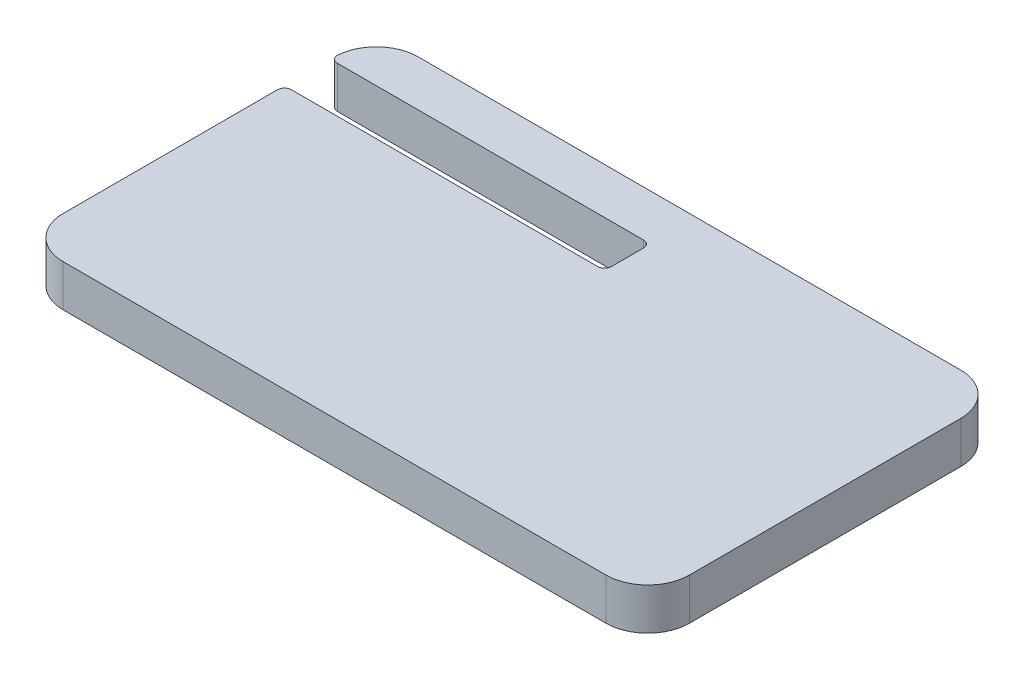
ISO-10303-21;
HEADER;
FILE_DESCRIPTION(('STEP AP214'),'2;1');
FILE_NAME('part.step','',(''),(''),'','','');
FILE_SCHEMA(('AUTOMOTIVE_DESIGN { 1 0 10303 214 1 1 1 1 }'));
ENDSEC;
DATA;
#1=APPLICATION_CONTEXT('core data for automotive mechanical design processes');
#2=APPLICATION_PROTOCOL_DEFINITION('international standard','automotive_design',2000,#1);
#3=PRODUCT_CONTEXT('',#1,'mechanical');
#4=PRODUCT('Part','Part','',(#3));
#5=PRODUCT_RELATED_PRODUCT_CATEGORY('part','',(#4));
#6=PRODUCT_DEFINITION_FORMATION('','',#4);
#7=PRODUCT_DEFINITION_CONTEXT('part definition',#1,'design');
#8=PRODUCT_DEFINITION('design','',#6,#7);
#9=PRODUCT_DEFINITION_SHAPE('','',#8);
#10=(LENGTH_UNIT() NAMED_UNIT(*) SI_UNIT(.MILLI.,.METRE.));
#11=(NAMED_UNIT(*) PLANE_ANGLE_UNIT() SI_UNIT($,.RADIAN.));
#12=(NAMED_UNIT(*) SI_UNIT($,.STERADIAN.) SOLID_ANGLE_UNIT());
#13=UNCERTAINTY_MEASURE_WITH_UNIT(LENGTH_MEASURE(1.E-05),#10,'distance_accuracy_value','');
#14=(GEOMETRIC_REPRESENTATION_CONTEXT(3) GLOBAL_UNCERTAINTY_ASSIGNED_CONTEXT((#13)) GLOBAL_UNIT_ASSIGNED_CONTEXT((#10,
#11,#12)) REPRESENTATION_CONTEXT('',''));
#15=CARTESIAN_POINT('',(0.,0.,0.));
#16=DIRECTION('',(0.,0.,1.));
#17=DIRECTION('',(1.,0.,0.));
#18=AXIS2_PLACEMENT_3D('',#15,#16,#17);
#19=CARTESIAN_POINT('',(-22.5,3.,-9.92984720943611));
#20=DIRECTION('',(1.,0.,0.));
#21=DIRECTION('',(0.,0.,-1.));
#22=AXIS2_PLACEMENT_3D('',#19,#20,#21);
#23=PLANE('',#22);
#24=DIRECTION('',(0.,0.,1.));
#25=VECTOR('',#24,1.);
#26=CARTESIAN_POINT('',(-22.5,3.,-9.92984720943611));
#27=LINE('',#26,#25);
#28=CARTESIAN_POINT('',(-22.5,3.,-2.82984720943611));
#29=VERTEX_POINT('',#28);
#30=CARTESIAN_POINT('',(-22.5,3.,12.5701527905639));
#31=VERTEX_POINT('',#30);
#32=EDGE_CURVE('E181',#29,#31,#27,.T.);
#33=ORIENTED_EDGE('',*,*,#32,.F.);
#34=DIRECTION('',(0.,1.,0.));
#35=VECTOR('',#34,1.);
#36=CARTESIAN_POINT('',(-22.5,3.,-2.82984720943611));
#37=LINE('',#36,#35);
#38=CARTESIAN_POINT('',(-22.5,0.,-2.82984720943611));
#39=VERTEX_POINT('',#38);
#40=EDGE_CURVE('E216',#29,#39,#37,.F.);
#41=ORIENTED_EDGE('',*,*,#40,.T.);
#42=DIRECTION('',(0.,0.,1.));
#43=VECTOR('',#42,1.);
#44=CARTESIAN_POINT('',(-22.5,0.,-9.92984720943611));
#45=LINE('',#44,#43);
#46=CARTESIAN_POINT('',(-22.5,0.,12.5701527905639));
#47=VERTEX_POINT('',#46);
#48=EDGE_CURVE('E170',#39,#47,#45,.T.);
#49=ORIENTED_EDGE('',*,*,#48,.T.);
#50=DIRECTION('',(0.,-1.,0.));
#51=VECTOR('',#50,1.);
#52=CARTESIAN_POINT('',(-22.5,3.,12.5701527905639));
#53=LINE('',#52,#51);
#54=EDGE_CURVE('E150',#47,#31,#53,.F.);
#55=ORIENTED_EDGE('',*,*,#54,.T.);
#56=EDGE_LOOP('',(#33,#41,#49,#55));
#57=FACE_BOUND('',#56,.T.);
#58=ADVANCED_FACE('F37',(#57),#23,.F.);
#59=CARTESIAN_POINT('',(-22.5,3.,15.5701527905639));
#60=DIRECTION('',(0.,0.,-1.));
#61=DIRECTION('',(-1.,0.,0.));
#62=AXIS2_PLACEMENT_3D('',#59,#60,#61);
#63=PLANE('',#62);
#64=DIRECTION('',(1.,0.,0.));
#65=VECTOR('',#64,1.);
#66=CARTESIAN_POINT('',(-22.5,3.,15.5701527905639));
#67=LINE('',#66,#65);
#68=CARTESIAN_POINT('',(-19.5,3.,15.5701527905639));
#69=VERTEX_POINT('',#68);
#70=CARTESIAN_POINT('',(19.5,3.,15.5701527905639));
#71=VERTEX_POINT('',#70);
#72=EDGE_CURVE('E162',#69,#71,#67,.T.);
#73=ORIENTED_EDGE('',*,*,#72,.F.);
#74=DIRECTION('',(0.,-1.,0.));
#75=VECTOR('',#74,1.);
#76=CARTESIAN_POINT('',(-19.5,3.,15.5701527905639));
#77=LINE('',#76,#75);
#78=CARTESIAN_POINT('',(-19.5,0.,15.5701527905639));
#79=VERTEX_POINT('',#78);
#80=EDGE_CURVE('E148',#69,#79,#77,.T.);
#81=ORIENTED_EDGE('',*,*,#80,.T.);
#82=DIRECTION('',(1.,0.,0.));
#83=VECTOR('',#82,1.);
#84=CARTESIAN_POINT('',(-22.5,0.,15.5701527905639));
#85=LINE('',#84,#83);
#86=CARTESIAN_POINT('',(19.5,0.,15.5701527905639));
#87=VERTEX_POINT('',#86);
#88=EDGE_CURVE('E159',#79,#87,#85,.T.);
#89=ORIENTED_EDGE('',*,*,#88,.T.);
#90=DIRECTION('',(0.,-1.,0.));
#91=VECTOR('',#90,1.);
#92=CARTESIAN_POINT('',(19.5,3.,15.5701527905639));
#93=LINE('',#92,#91);
#94=EDGE_CURVE('E164',#87,#71,#93,.F.);
#95=ORIENTED_EDGE('',*,*,#94,.T.);
#96=EDGE_LOOP('',(#73,#81,#89,#95));
#97=FACE_BOUND('',#96,.T.);
#98=ADVANCED_FACE('F158',(#97),#63,.F.);
#99=CARTESIAN_POINT('',(22.5,3.,-9.92984720943611));
#100=DIRECTION('',(-1.,0.,0.));
#101=DIRECTION('',(0.,0.,1.));
#102=AXIS2_PLACEMENT_3D('',#99,#100,#101);
#103=PLANE('',#102);
#104=DIRECTION('',(0.,0.,-1.));
#105=VECTOR('',#104,1.);
#106=CARTESIAN_POINT('',(22.5,3.,-9.92984720943611));
#107=LINE('',#106,#105);
#108=CARTESIAN_POINT('',(22.5,3.,12.5701527905639));
#109=VERTEX_POINT('',#108);
#110=CARTESIAN_POINT('',(22.5,3.,-6.92984720943611));
#111=VERTEX_POINT('',#110);
#112=EDGE_CURVE('E271',#109,#111,#107,.T.);
#113=ORIENTED_EDGE('',*,*,#112,.F.);
#114=DIRECTION('',(0.,-1.,0.));
#115=VECTOR('',#114,1.);
#116=CARTESIAN_POINT('',(22.5,3.,12.5701527905639));
#117=LINE('',#116,#115);
#118=CARTESIAN_POINT('',(22.5,0.,12.5701527905639));
#119=VERTEX_POINT('',#118);
#120=EDGE_CURVE('E204',#109,#119,#117,.T.);
#121=ORIENTED_EDGE('',*,*,#120,.T.);
#122=DIRECTION('',(0.,0.,-1.));
#123=VECTOR('',#122,1.);
#124=CARTESIAN_POINT('',(22.5,0.,-9.92984720943611));
#125=LINE('',#124,#123);
#126=CARTESIAN_POINT('',(22.5,0.,-6.92984720943611));
#127=VERTEX_POINT('',#126);
#128=EDGE_CURVE('E169',#119,#127,#125,.T.);
#129=ORIENTED_EDGE('',*,*,#128,.T.);
#130=DIRECTION('',(0.,-1.,0.));
#131=VECTOR('',#130,1.);
#132=CARTESIAN_POINT('',(22.5,3.,-6.92984720943611));
#133=LINE('',#132,#131);
#134=EDGE_CURVE('E202',#127,#111,#133,.F.);
#135=ORIENTED_EDGE('',*,*,#134,.T.);
#136=EDGE_LOOP('',(#113,#121,#129,#135));
#137=FACE_BOUND('',#136,.T.);
#138=ADVANCED_FACE('F295',(#137),#103,.F.);
#139=CARTESIAN_POINT('',(-22.5,3.,-9.92984720943611));
#140=DIRECTION('',(0.,0.,1.));
#141=DIRECTION('',(1.,0.,0.));
#142=AXIS2_PLACEMENT_3D('',#139,#140,#141);
#143=PLANE('',#142);
#144=DIRECTION('',(-1.,0.,0.));
#145=VECTOR('',#144,1.);
#146=CARTESIAN_POINT('',(-22.5,0.,-9.92984720943611));
#147=LINE('',#146,#145);
#148=CARTESIAN_POINT('',(19.5,0.,-9.92984720943611));
#149=VERTEX_POINT('',#148);
#150=CARTESIAN_POINT('',(-19.5,0.,-9.92984720943611));
#151=VERTEX_POINT('',#150);
#152=EDGE_CURVE('E173',#149,#151,#147,.T.);
#153=ORIENTED_EDGE('',*,*,#152,.T.);
#154=DIRECTION('',(0.,-1.,0.));
#155=VECTOR('',#154,1.);
#156=CARTESIAN_POINT('',(-19.5,3.,-9.92984720943611));
#157=LINE('',#156,#155);
#158=CARTESIAN_POINT('',(-19.5,3.,-9.92984720943611));
#159=VERTEX_POINT('',#158);
#160=EDGE_CURVE('E200',#151,#159,#157,.F.);
#161=ORIENTED_EDGE('',*,*,#160,.T.);
#162=DIRECTION('',(-1.,0.,0.));
#163=VECTOR('',#162,1.);
#164=CARTESIAN_POINT('',(-22.5,3.,-9.92984720943611));
#165=LINE('',#164,#163);
#166=CARTESIAN_POINT('',(19.5,3.,-9.92984720943611));
#167=VERTEX_POINT('',#166);
#168=EDGE_CURVE('E182',#167,#159,#165,.T.);
#169=ORIENTED_EDGE('',*,*,#168,.F.);
#170=DIRECTION('',(0.,-1.,0.));
#171=VECTOR('',#170,1.);
#172=CARTESIAN_POINT('',(19.5,3.,-9.92984720943611));
#173=LINE('',#172,#171);
#174=EDGE_CURVE('E197',#167,#149,#173,.T.);
#175=ORIENTED_EDGE('',*,*,#174,.T.);
#176=EDGE_LOOP('',(#153,#161,#169,#175));
#177=FACE_BOUND('',#176,.T.);
#178=ADVANCED_FACE('F334',(#177),#143,.F.);
#179=CARTESIAN_POINT('',(0.,3.,0.));
#180=DIRECTION('',(0.,1.,0.));
#181=DIRECTION('',(0.,0.,1.));
#182=AXIS2_PLACEMENT_3D('',#179,#180,#181);
#183=PLANE('',#182);
#184=DIRECTION('',(1.,0.,0.));
#185=VECTOR('',#184,1.);
#186=CARTESIAN_POINT('',(-22.5,3.,-3.32984720943611));
#187=LINE('',#186,#185);
#188=CARTESIAN_POINT('',(-22.,3.,-3.32984720943611));
#189=VERTEX_POINT('',#188);
#190=CARTESIAN_POINT('',(0.,3.,-3.32984720943611));
#191=VERTEX_POINT('',#190);
#192=EDGE_CURVE('E253',#189,#191,#187,.T.);
#193=ORIENTED_EDGE('',*,*,#192,.F.);
#194=CARTESIAN_POINT('',(-22.,3.,-2.82984720943611));
#195=DIRECTION('',(0.,1.,0.));
#196=DIRECTION('',(0.,0.,1.));
#197=AXIS2_PLACEMENT_3D('',#194,#195,#196);
#198=CIRCLE('',#197,0.5);
#199=EDGE_CURVE('E214',#189,#29,#198,.T.);
#200=ORIENTED_EDGE('',*,*,#199,.T.);
#201=ORIENTED_EDGE('',*,*,#32,.T.);
#202=CARTESIAN_POINT('',(-19.5,3.,12.5701527905639));
#203=DIRECTION('',(0.,1.,0.));
#204=DIRECTION('',(0.,0.,1.));
#205=AXIS2_PLACEMENT_3D('',#202,#203,#204);
#206=CIRCLE('',#205,3.);
#207=EDGE_CURVE('E195',#31,#69,#206,.T.);
#208=ORIENTED_EDGE('',*,*,#207,.T.);
#209=ORIENTED_EDGE('',*,*,#72,.T.);
#210=CARTESIAN_POINT('',(19.5,3.,12.5701527905639));
#211=DIRECTION('',(0.,1.,0.));
#212=DIRECTION('',(0.,0.,1.));
#213=AXIS2_PLACEMENT_3D('',#210,#211,#212);
#214=CIRCLE('',#213,3.);
#215=EDGE_CURVE('E190',#71,#109,#214,.T.);
#216=ORIENTED_EDGE('',*,*,#215,.T.);
#217=ORIENTED_EDGE('',*,*,#112,.T.);
#218=CARTESIAN_POINT('',(19.5,3.,-6.92984720943611));
#219=DIRECTION('',(0.,1.,0.));
#220=DIRECTION('',(0.,0.,1.));
#221=AXIS2_PLACEMENT_3D('',#218,#219,#220);
#222=CIRCLE('',#221,3.);
#223=EDGE_CURVE('E188',#111,#167,#222,.T.);
#224=ORIENTED_EDGE('',*,*,#223,.T.);
#225=ORIENTED_EDGE('',*,*,#168,.T.);
#226=CARTESIAN_POINT('',(-19.5,3.,-6.92984720943611));
#227=DIRECTION('',(0.,1.,0.));
#228=DIRECTION('',(0.,0.,1.));
#229=AXIS2_PLACEMENT_3D('',#226,#227,#228);
#230=CIRCLE('',#229,3.);
#231=CARTESIAN_POINT('',(-22.4903845906505,3.,-7.16984720943611));
#232=VERTEX_POINT('',#231);
#233=EDGE_CURVE('E192',#159,#232,#230,.T.);
#234=ORIENTED_EDGE('',*,*,#233,.T.);
#235=CARTESIAN_POINT('',(-21.9919871588754,3.,-7.12984720943611));
#236=DIRECTION('',(0.,1.,0.));
#237=DIRECTION('',(0.,0.,1.));
#238=AXIS2_PLACEMENT_3D('',#235,#236,#237);
#239=CIRCLE('',#238,0.5);
#240=CARTESIAN_POINT('',(-21.9919871588754,3.,-6.62984720943611));
#241=VERTEX_POINT('',#240);
#242=EDGE_CURVE('E212',#232,#241,#239,.T.);
#243=ORIENTED_EDGE('',*,*,#242,.T.);
#244=DIRECTION('',(-1.,0.,0.));
#245=VECTOR('',#244,1.);
#246=CARTESIAN_POINT('',(-22.5,3.,-6.62984720943611));
#247=LINE('',#246,#245);
#248=CARTESIAN_POINT('',(0.,3.,-6.62984720943611));
#249=VERTEX_POINT('',#248);
#250=EDGE_CURVE('E245',#249,#241,#247,.T.);
#251=ORIENTED_EDGE('',*,*,#250,.F.);
#252=CARTESIAN_POINT('',(0.,3.,-6.12984720943611));
#253=DIRECTION('',(0.,1.,0.));
#254=DIRECTION('',(0.,0.,1.));
#255=AXIS2_PLACEMENT_3D('',#252,#253,#254);
#256=CIRCLE('',#255,0.5);
#257=CARTESIAN_POINT('',(0.5,3.,-6.12984720943611));
#258=VERTEX_POINT('',#257);
#259=EDGE_CURVE('E45',#249,#258,#256,.F.);
#260=ORIENTED_EDGE('',*,*,#259,.T.);
#261=DIRECTION('',(0.,0.,-1.));
#262=VECTOR('',#261,1.);
#263=CARTESIAN_POINT('',(0.5,3.,-6.62984720943611));
#264=LINE('',#263,#262);
#265=CARTESIAN_POINT('',(0.500000000000001,3.,-3.82984720943611));
#266=VERTEX_POINT('',#265);
#267=EDGE_CURVE('E243',#266,#258,#264,.T.);
#268=ORIENTED_EDGE('',*,*,#267,.F.);
#269=CARTESIAN_POINT('',(0.,3.,-3.82984720943611));
#270=DIRECTION('',(0.,1.,0.));
#271=DIRECTION('',(0.,0.,1.));
#272=AXIS2_PLACEMENT_3D('',#269,#270,#271);
#273=CIRCLE('',#272,0.5);
#274=EDGE_CURVE('E234',#266,#191,#273,.F.);
#275=ORIENTED_EDGE('',*,*,#274,.T.);
#276=EDGE_LOOP('',(#193,#200,#201,#208,#209,#216,#217,#224,#225,#234,#243,#251,#260,#268,#275));
#277=FACE_BOUND('',#276,.T.);
#278=ADVANCED_FACE('F242',(#277),#183,.T.);
#279=CARTESIAN_POINT('',(0.,0.,0.));
#280=DIRECTION('',(0.,1.,0.));
#281=DIRECTION('',(0.,0.,1.));
#282=AXIS2_PLACEMENT_3D('',#279,#280,#281);
#283=PLANE('',#282);
#284=ORIENTED_EDGE('',*,*,#48,.F.);
#285=CARTESIAN_POINT('',(-22.,0.,-2.82984720943611));
#286=DIRECTION('',(0.,1.,0.));
#287=DIRECTION('',(0.,0.,1.));
#288=AXIS2_PLACEMENT_3D('',#285,#286,#287);
#289=CIRCLE('',#288,0.5);
#290=CARTESIAN_POINT('',(-22.,0.,-3.32984720943611));
#291=VERTEX_POINT('',#290);
#292=EDGE_CURVE('E219',#39,#291,#289,.F.);
#293=ORIENTED_EDGE('',*,*,#292,.T.);
#294=DIRECTION('',(-1.,0.,0.));
#295=VECTOR('',#294,1.);
#296=CARTESIAN_POINT('',(-22.5,0.,-3.32984720943611));
#297=LINE('',#296,#295);
#298=CARTESIAN_POINT('',(0.,0.,-3.32984720943611));
#299=VERTEX_POINT('',#298);
#300=EDGE_CURVE('E175',#299,#291,#297,.T.);
#301=ORIENTED_EDGE('',*,*,#300,.F.);
#302=CARTESIAN_POINT('',(0.,0.,-3.82984720943611));
#303=DIRECTION('',(0.,1.,0.));
#304=DIRECTION('',(0.,0.,1.));
#305=AXIS2_PLACEMENT_3D('',#302,#303,#304);
#306=CIRCLE('',#305,0.5);
#307=CARTESIAN_POINT('',(0.500000000000001,0.,-3.82984720943611));
#308=VERTEX_POINT('',#307);
#309=EDGE_CURVE('E236',#299,#308,#306,.T.);
#310=ORIENTED_EDGE('',*,*,#309,.T.);
#311=DIRECTION('',(0.,0.,1.));
#312=VECTOR('',#311,1.);
#313=CARTESIAN_POINT('',(0.5,0.,-6.62984720943611));
#314=LINE('',#313,#312);
#315=CARTESIAN_POINT('',(0.5,0.,-6.12984720943611));
#316=VERTEX_POINT('',#315);
#317=EDGE_CURVE('E260',#316,#308,#314,.T.);
#318=ORIENTED_EDGE('',*,*,#317,.F.);
#319=CARTESIAN_POINT('',(0.,0.,-6.12984720943611));
#320=DIRECTION('',(0.,1.,0.));
#321=DIRECTION('',(0.,0.,1.));
#322=AXIS2_PLACEMENT_3D('',#319,#320,#321);
#323=CIRCLE('',#322,0.5);
#324=CARTESIAN_POINT('',(0.,0.,-6.62984720943611));
#325=VERTEX_POINT('',#324);
#326=EDGE_CURVE('E11',#316,#325,#323,.T.);
#327=ORIENTED_EDGE('',*,*,#326,.T.);
#328=DIRECTION('',(1.,0.,0.));
#329=VECTOR('',#328,1.);
#330=CARTESIAN_POINT('',(-22.5,0.,-6.62984720943611));
#331=LINE('',#330,#329);
#332=CARTESIAN_POINT('',(-21.9919871588754,0.,-6.62984720943611));
#333=VERTEX_POINT('',#332);
#334=EDGE_CURVE('E259',#333,#325,#331,.T.);
#335=ORIENTED_EDGE('',*,*,#334,.F.);
#336=CARTESIAN_POINT('',(-21.9919871588754,0.,-7.12984720943611));
#337=DIRECTION('',(0.,1.,0.));
#338=DIRECTION('',(0.,0.,1.));
#339=AXIS2_PLACEMENT_3D('',#336,#337,#338);
#340=CIRCLE('',#339,0.5);
#341=CARTESIAN_POINT('',(-22.4903845906505,0.,-7.16984720943611));
#342=VERTEX_POINT('',#341);
#343=EDGE_CURVE('E52',#333,#342,#340,.F.);
#344=ORIENTED_EDGE('',*,*,#343,.T.);
#345=CARTESIAN_POINT('',(-19.5,0.,-6.92984720943611));
#346=DIRECTION('',(0.,1.,0.));
#347=DIRECTION('',(0.,0.,1.));
#348=AXIS2_PLACEMENT_3D('',#345,#346,#347);
#349=CIRCLE('',#348,3.);
#350=EDGE_CURVE('E153',#342,#151,#349,.F.);
#351=ORIENTED_EDGE('',*,*,#350,.T.);
#352=ORIENTED_EDGE('',*,*,#152,.F.);
#353=CARTESIAN_POINT('',(19.5,0.,-6.92984720943611));
#354=DIRECTION('',(0.,1.,0.));
#355=DIRECTION('',(0.,0.,1.));
#356=AXIS2_PLACEMENT_3D('',#353,#354,#355);
#357=CIRCLE('',#356,3.);
#358=EDGE_CURVE('E163',#149,#127,#357,.F.);
#359=ORIENTED_EDGE('',*,*,#358,.T.);
#360=ORIENTED_EDGE('',*,*,#128,.F.);
#361=CARTESIAN_POINT('',(19.5,0.,12.5701527905639));
#362=DIRECTION('',(0.,1.,0.));
#363=DIRECTION('',(0.,0.,1.));
#364=AXIS2_PLACEMENT_3D('',#361,#362,#363);
#365=CIRCLE('',#364,3.);
#366=EDGE_CURVE('E168',#119,#87,#365,.F.);
#367=ORIENTED_EDGE('',*,*,#366,.T.);
#368=ORIENTED_EDGE('',*,*,#88,.F.);
#369=CARTESIAN_POINT('',(-19.5,0.,12.5701527905639));
#370=DIRECTION('',(0.,1.,0.));
#371=DIRECTION('',(0.,0.,1.));
#372=AXIS2_PLACEMENT_3D('',#369,#370,#371);
#373=CIRCLE('',#372,3.);
#374=EDGE_CURVE('E144',#79,#47,#373,.F.);
#375=ORIENTED_EDGE('',*,*,#374,.T.);
#376=EDGE_LOOP('',(#284,#293,#301,#310,#318,#327,#335,#344,#351,#352,#359,#360,#367,#368,#375));
#377=FACE_BOUND('',#376,.T.);
#378=ADVANCED_FACE('F166',(#377),#283,.F.);
#379=CARTESIAN_POINT('',(-22.5,-23.2355331335435,-6.62984720943611));
#380=DIRECTION('',(0.,0.,-1.));
#381=DIRECTION('',(-1.,0.,0.));
#382=AXIS2_PLACEMENT_3D('',#379,#380,#381);
#383=PLANE('',#382);
#384=ORIENTED_EDGE('',*,*,#334,.T.);
#385=DIRECTION('',(0.,1.,0.));
#386=VECTOR('',#385,1.);
#387=CARTESIAN_POINT('',(0.,3.,-6.62984720943611));
#388=LINE('',#387,#386);
#389=EDGE_CURVE('E228',#325,#249,#388,.T.);
#390=ORIENTED_EDGE('',*,*,#389,.T.);
#391=ORIENTED_EDGE('',*,*,#250,.T.);
#392=DIRECTION('',(0.,1.,0.));
#393=VECTOR('',#392,1.);
#394=CARTESIAN_POINT('',(-21.9919871588754,0.,-6.62984720943611));
#395=LINE('',#394,#393);
#396=EDGE_CURVE('E226',#241,#333,#395,.F.);
#397=ORIENTED_EDGE('',*,*,#396,.T.);
#398=EDGE_LOOP('',(#384,#390,#391,#397));
#399=FACE_BOUND('',#398,.T.);
#400=ADVANCED_FACE('F257',(#399),#383,.F.);
#401=CARTESIAN_POINT('',(0.5,-23.2355331335435,-6.62984720943611));
#402=DIRECTION('',(1.,0.,0.));
#403=DIRECTION('',(0.,0.,-1.));
#404=AXIS2_PLACEMENT_3D('',#401,#402,#403);
#405=PLANE('',#404);
#406=ORIENTED_EDGE('',*,*,#317,.T.);
#407=DIRECTION('',(0.,1.,0.));
#408=VECTOR('',#407,1.);
#409=CARTESIAN_POINT('',(0.500000000000001,3.,-3.82984720943611));
#410=LINE('',#409,#408);
#411=EDGE_CURVE('E223',#308,#266,#410,.T.);
#412=ORIENTED_EDGE('',*,*,#411,.T.);
#413=ORIENTED_EDGE('',*,*,#267,.T.);
#414=DIRECTION('',(0.,1.,0.));
#415=VECTOR('',#414,1.);
#416=CARTESIAN_POINT('',(0.5,0.,-6.12984720943611));
#417=LINE('',#416,#415);
#418=EDGE_CURVE('E221',#258,#316,#417,.F.);
#419=ORIENTED_EDGE('',*,*,#418,.T.);
#420=EDGE_LOOP('',(#406,#412,#413,#419));
#421=FACE_BOUND('',#420,.T.);
#422=ADVANCED_FACE('F251',(#421),#405,.F.);
#423=CARTESIAN_POINT('',(-22.5,-23.2355331335435,-3.32984720943611));
#424=DIRECTION('',(0.,0.,1.));
#425=DIRECTION('',(1.,0.,0.));
#426=AXIS2_PLACEMENT_3D('',#423,#424,#425);
#427=PLANE('',#426);
#428=ORIENTED_EDGE('',*,*,#300,.T.);
#429=DIRECTION('',(0.,1.,0.));
#430=VECTOR('',#429,1.);
#431=CARTESIAN_POINT('',(-22.,-23.2355331335435,-3.32984720943611));
#432=LINE('',#431,#430);
#433=EDGE_CURVE('E209',#291,#189,#432,.T.);
#434=ORIENTED_EDGE('',*,*,#433,.T.);
#435=ORIENTED_EDGE('',*,*,#192,.T.);
#436=DIRECTION('',(0.,1.,0.));
#437=VECTOR('',#436,1.);
#438=CARTESIAN_POINT('',(0.,0.,-3.32984720943611));
#439=LINE('',#438,#437);
#440=EDGE_CURVE('E207',#191,#299,#439,.F.);
#441=ORIENTED_EDGE('',*,*,#440,.T.);
#442=EDGE_LOOP('',(#428,#434,#435,#441));
#443=FACE_BOUND('',#442,.T.);
#444=ADVANCED_FACE('F302',(#443),#427,.F.);
#445=CARTESIAN_POINT('',(-19.5,3.,12.5701527905639));
#446=DIRECTION('',(0.,-1.,0.));
#447=DIRECTION('',(0.,0.,-1.));
#448=AXIS2_PLACEMENT_3D('',#445,#446,#447);
#449=CYLINDRICAL_SURFACE('',#448,3.);
#450=ORIENTED_EDGE('',*,*,#207,.F.);
#451=ORIENTED_EDGE('',*,*,#54,.F.);
#452=ORIENTED_EDGE('',*,*,#374,.F.);
#453=ORIENTED_EDGE('',*,*,#80,.F.);
#454=EDGE_LOOP('',(#450,#451,#452,#453));
#455=FACE_BOUND('',#454,.T.);
#456=ADVANCED_FACE('F147',(#455),#449,.T.);
#457=CARTESIAN_POINT('',(-19.5,3.,-6.92984720943611));
#458=DIRECTION('',(0.,-1.,0.));
#459=DIRECTION('',(0.,0.,-1.));
#460=AXIS2_PLACEMENT_3D('',#457,#458,#459);
#461=CYLINDRICAL_SURFACE('',#460,3.);
#462=ORIENTED_EDGE('',*,*,#350,.F.);
#463=DIRECTION('',(0.,-1.,0.));
#464=VECTOR('',#463,1.);
#465=CARTESIAN_POINT('',(-22.4903845906505,3.,-7.16984720943611));
#466=LINE('',#465,#464);
#467=EDGE_CURVE('E231',#342,#232,#466,.F.);
#468=ORIENTED_EDGE('',*,*,#467,.T.);
#469=ORIENTED_EDGE('',*,*,#233,.F.);
#470=ORIENTED_EDGE('',*,*,#160,.F.);
#471=EDGE_LOOP('',(#462,#468,#469,#470));
#472=FACE_BOUND('',#471,.T.);
#473=ADVANCED_FACE('F281',(#472),#461,.T.);
#474=CARTESIAN_POINT('',(19.5,3.,12.5701527905639));
#475=DIRECTION('',(0.,-1.,0.));
#476=DIRECTION('',(0.,0.,-1.));
#477=AXIS2_PLACEMENT_3D('',#474,#475,#476);
#478=CYLINDRICAL_SURFACE('',#477,3.);
#479=ORIENTED_EDGE('',*,*,#215,.F.);
#480=ORIENTED_EDGE('',*,*,#94,.F.);
#481=ORIENTED_EDGE('',*,*,#366,.F.);
#482=ORIENTED_EDGE('',*,*,#120,.F.);
#483=EDGE_LOOP('',(#479,#480,#481,#482));
#484=FACE_BOUND('',#483,.T.);
#485=ADVANCED_FACE('F305',(#484),#478,.T.);
#486=CARTESIAN_POINT('',(19.5,3.,-6.92984720943611));
#487=DIRECTION('',(0.,-1.,0.));
#488=DIRECTION('',(0.,0.,-1.));
#489=AXIS2_PLACEMENT_3D('',#486,#487,#488);
#490=CYLINDRICAL_SURFACE('',#489,3.);
#491=ORIENTED_EDGE('',*,*,#223,.F.);
#492=ORIENTED_EDGE('',*,*,#134,.F.);
#493=ORIENTED_EDGE('',*,*,#358,.F.);
#494=ORIENTED_EDGE('',*,*,#174,.F.);
#495=EDGE_LOOP('',(#491,#492,#493,#494));
#496=FACE_BOUND('',#495,.T.);
#497=ADVANCED_FACE('F308',(#496),#490,.T.);
#498=CARTESIAN_POINT('',(-22.,-23.2355331335435,-2.82984720943611));
#499=DIRECTION('',(0.,1.,0.));
#500=DIRECTION('',(0.,0.,1.));
#501=AXIS2_PLACEMENT_3D('',#498,#499,#500);
#502=CYLINDRICAL_SURFACE('',#501,0.5);
#503=ORIENTED_EDGE('',*,*,#292,.F.);
#504=ORIENTED_EDGE('',*,*,#40,.F.);
#505=ORIENTED_EDGE('',*,*,#199,.F.);
#506=ORIENTED_EDGE('',*,*,#433,.F.);
#507=EDGE_LOOP('',(#503,#504,#505,#506));
#508=FACE_BOUND('',#507,.T.);
#509=ADVANCED_FACE('F312',(#508),#502,.T.);
#510=CARTESIAN_POINT('',(0.,-23.2355331335435,-3.82984720943611));
#511=DIRECTION('',(0.,-1.,0.));
#512=DIRECTION('',(0.,0.,-1.));
#513=AXIS2_PLACEMENT_3D('',#510,#511,#512);
#514=CYLINDRICAL_SURFACE('',#513,0.5);
#515=ORIENTED_EDGE('',*,*,#309,.F.);
#516=ORIENTED_EDGE('',*,*,#440,.F.);
#517=ORIENTED_EDGE('',*,*,#274,.F.);
#518=ORIENTED_EDGE('',*,*,#411,.F.);
#519=EDGE_LOOP('',(#515,#516,#517,#518));
#520=FACE_BOUND('',#519,.T.);
#521=ADVANCED_FACE('F288',(#520),#514,.F.);
#522=CARTESIAN_POINT('',(0.,-23.2355331335435,-6.12984720943611));
#523=DIRECTION('',(0.,-1.,0.));
#524=DIRECTION('',(0.,0.,-1.));
#525=AXIS2_PLACEMENT_3D('',#522,#523,#524);
#526=CYLINDRICAL_SURFACE('',#525,0.5);
#527=ORIENTED_EDGE('',*,*,#326,.F.);
#528=ORIENTED_EDGE('',*,*,#418,.F.);
#529=ORIENTED_EDGE('',*,*,#259,.F.);
#530=ORIENTED_EDGE('',*,*,#389,.F.);
#531=EDGE_LOOP('',(#527,#528,#529,#530));
#532=FACE_BOUND('',#531,.T.);
#533=ADVANCED_FACE('F255',(#532),#526,.F.);
#534=CARTESIAN_POINT('',(-21.9919871588754,3.,-7.12984720943611));
#535=DIRECTION('',(0.,-1.,0.));
#536=DIRECTION('',(0.,0.,-1.));
#537=AXIS2_PLACEMENT_3D('',#534,#535,#536);
#538=CYLINDRICAL_SURFACE('',#537,0.5);
#539=ORIENTED_EDGE('',*,*,#343,.F.);
#540=ORIENTED_EDGE('',*,*,#396,.F.);
#541=ORIENTED_EDGE('',*,*,#242,.F.);
#542=ORIENTED_EDGE('',*,*,#467,.F.);
#543=EDGE_LOOP('',(#539,#540,#541,#542));
#544=FACE_BOUND('',#543,.T.);
#545=ADVANCED_FACE('F39',(#544),#538,.T.);
#546=CLOSED_SHELL('',(#58,#98,#138,#178,#278,#378,#400,#422,#444,#456,#473,#485,#497,#509,#521,
#533,#545));
#547=MANIFOLD_SOLID_BREP('B2',#546);
#548=ADVANCED_BREP_SHAPE_REPRESENTATION('',(#18,#547),#14);
#549=SHAPE_DEFINITION_REPRESENTATION(#9,#548);
ENDSEC;
END-ISO-10303-21;
